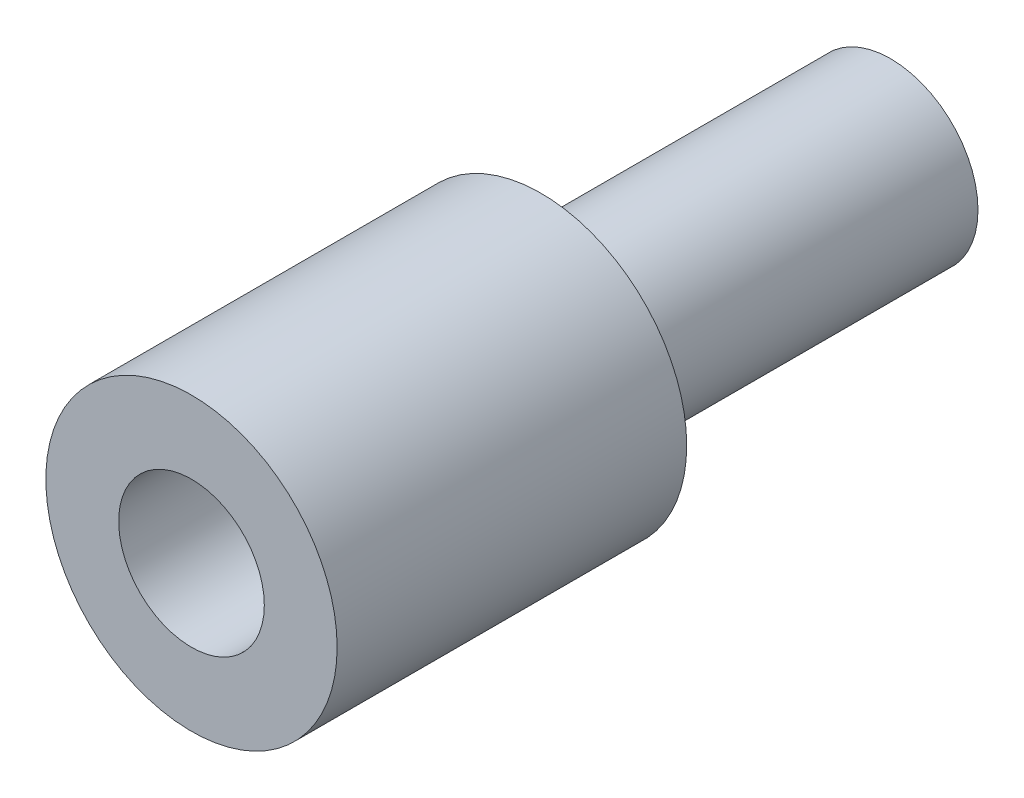
ISO-10303-21;
HEADER;
FILE_DESCRIPTION(('STEP AP214'),'2;1');
FILE_NAME('part.step','',(''),(''),'','','');
FILE_SCHEMA(('AUTOMOTIVE_DESIGN { 1 0 10303 214 1 1 1 1 }'));
ENDSEC;
DATA;
#1=APPLICATION_CONTEXT('core data for automotive mechanical design processes');
#2=APPLICATION_PROTOCOL_DEFINITION('international standard','automotive_design',2000,#1);
#3=PRODUCT_CONTEXT('',#1,'mechanical');
#4=PRODUCT('Part','Part','',(#3));
#5=PRODUCT_RELATED_PRODUCT_CATEGORY('part','',(#4));
#6=PRODUCT_DEFINITION_FORMATION('','',#4);
#7=PRODUCT_DEFINITION_CONTEXT('part definition',#1,'design');
#8=PRODUCT_DEFINITION('design','',#6,#7);
#9=PRODUCT_DEFINITION_SHAPE('','',#8);
#10=(LENGTH_UNIT() NAMED_UNIT(*) SI_UNIT(.MILLI.,.METRE.));
#11=(NAMED_UNIT(*) PLANE_ANGLE_UNIT() SI_UNIT($,.RADIAN.));
#12=(NAMED_UNIT(*) SI_UNIT($,.STERADIAN.) SOLID_ANGLE_UNIT());
#13=UNCERTAINTY_MEASURE_WITH_UNIT(LENGTH_MEASURE(1.E-05),#10,'distance_accuracy_value','');
#14=(GEOMETRIC_REPRESENTATION_CONTEXT(3) GLOBAL_UNCERTAINTY_ASSIGNED_CONTEXT((#13)) GLOBAL_UNIT_ASSIGNED_CONTEXT((#10,
#11,#12)) REPRESENTATION_CONTEXT('',''));
#15=CARTESIAN_POINT('',(0.,0.,0.));
#16=DIRECTION('',(0.,0.,1.));
#17=DIRECTION('',(1.,0.,0.));
#18=AXIS2_PLACEMENT_3D('',#15,#16,#17);
#19=CARTESIAN_POINT('',(0.,0.,6.));
#20=DIRECTION('',(0.,0.,-1.));
#21=DIRECTION('',(-1.,0.,0.));
#22=AXIS2_PLACEMENT_3D('',#19,#20,#21);
#23=CYLINDRICAL_SURFACE('',#22,1.5);
#24=CARTESIAN_POINT('',(0.,0.,6.));
#25=DIRECTION('',(0.,0.,1.));
#26=DIRECTION('',(1.,0.,0.));
#27=AXIS2_PLACEMENT_3D('',#24,#25,#26);
#28=CIRCLE('',#27,1.5);
#29=CARTESIAN_POINT('',(1.5,0.,6.));
#30=VERTEX_POINT('',#29);
#31=EDGE_CURVE('E10',#30,#30,#28,.T.);
#32=ORIENTED_EDGE('',*,*,#31,.F.);
#33=EDGE_LOOP('',(#32));
#34=FACE_BOUND('',#33,.T.);
#35=CARTESIAN_POINT('',(0.,0.,0.));
#36=DIRECTION('',(0.,0.,1.));
#37=DIRECTION('',(1.,0.,0.));
#38=AXIS2_PLACEMENT_3D('',#35,#36,#37);
#39=CIRCLE('',#38,1.5);
#40=CARTESIAN_POINT('',(1.5,0.,0.));
#41=VERTEX_POINT('',#40);
#42=EDGE_CURVE('E42',#41,#41,#39,.T.);
#43=ORIENTED_EDGE('',*,*,#42,.T.);
#44=EDGE_LOOP('',(#43));
#45=FACE_BOUND('',#44,.T.);
#46=ADVANCED_FACE('F39',(#34,#45),#23,.T.);
#47=CARTESIAN_POINT('',(0.,0.,0.));
#48=DIRECTION('',(0.,0.,1.));
#49=DIRECTION('',(1.,0.,0.));
#50=AXIS2_PLACEMENT_3D('',#47,#48,#49);
#51=PLANE('',#50);
#52=ORIENTED_EDGE('',*,*,#42,.F.);
#53=EDGE_LOOP('',(#52));
#54=FACE_BOUND('',#53,.T.);
#55=ADVANCED_FACE('F87',(#54),#51,.F.);
#56=CARTESIAN_POINT('',(0.,0.,12.));
#57=DIRECTION('',(0.,0.,-1.));
#58=DIRECTION('',(-1.,0.,0.));
#59=AXIS2_PLACEMENT_3D('',#56,#57,#58);
#60=CYLINDRICAL_SURFACE('',#59,2.5);
#61=CARTESIAN_POINT('',(0.,0.,12.));
#62=DIRECTION('',(0.,0.,1.));
#63=DIRECTION('',(1.,0.,0.));
#64=AXIS2_PLACEMENT_3D('',#61,#62,#63);
#65=CIRCLE('',#64,2.5);
#66=CARTESIAN_POINT('',(2.5,0.,12.));
#67=VERTEX_POINT('',#66);
#68=EDGE_CURVE('E51',#67,#67,#65,.T.);
#69=ORIENTED_EDGE('',*,*,#68,.F.);
#70=EDGE_LOOP('',(#69));
#71=FACE_BOUND('',#70,.T.);
#72=CARTESIAN_POINT('',(0.,0.,6.));
#73=DIRECTION('',(0.,0.,1.));
#74=DIRECTION('',(1.,0.,0.));
#75=AXIS2_PLACEMENT_3D('',#72,#73,#74);
#76=CIRCLE('',#75,2.5);
#77=CARTESIAN_POINT('',(2.5,0.,6.));
#78=VERTEX_POINT('',#77);
#79=EDGE_CURVE('E53',#78,#78,#76,.T.);
#80=ORIENTED_EDGE('',*,*,#79,.T.);
#81=EDGE_LOOP('',(#80));
#82=FACE_BOUND('',#81,.T.);
#83=ADVANCED_FACE('F81',(#71,#82),#60,.T.);
#84=CARTESIAN_POINT('',(0.,0.,12.));
#85=DIRECTION('',(0.,0.,1.));
#86=DIRECTION('',(1.,0.,0.));
#87=AXIS2_PLACEMENT_3D('',#84,#85,#86);
#88=PLANE('',#87);
#89=CARTESIAN_POINT('',(0.,0.,12.));
#90=DIRECTION('',(0.,0.,1.));
#91=DIRECTION('',(1.,0.,0.));
#92=AXIS2_PLACEMENT_3D('',#89,#90,#91);
#93=CIRCLE('',#92,1.25);
#94=CARTESIAN_POINT('',(1.25,0.,12.));
#95=VERTEX_POINT('',#94);
#96=EDGE_CURVE('E61',#95,#95,#93,.T.);
#97=ORIENTED_EDGE('',*,*,#96,.F.);
#98=EDGE_LOOP('',(#97));
#99=FACE_BOUND('',#98,.T.);
#100=ORIENTED_EDGE('',*,*,#68,.T.);
#101=EDGE_LOOP('',(#100));
#102=FACE_BOUND('',#101,.T.);
#103=ADVANCED_FACE('F78',(#99,#102),#88,.T.);
#104=CARTESIAN_POINT('',(0.,0.,6.));
#105=DIRECTION('',(0.,0.,1.));
#106=DIRECTION('',(1.,0.,0.));
#107=AXIS2_PLACEMENT_3D('',#104,#105,#106);
#108=PLANE('',#107);
#109=ORIENTED_EDGE('',*,*,#31,.T.);
#110=EDGE_LOOP('',(#109));
#111=FACE_BOUND('',#110,.T.);
#112=ORIENTED_EDGE('',*,*,#79,.F.);
#113=EDGE_LOOP('',(#112));
#114=FACE_BOUND('',#113,.T.);
#115=ADVANCED_FACE('F74',(#111,#114),#108,.F.);
#116=CARTESIAN_POINT('',(0.,0.,6.));
#117=DIRECTION('',(0.,0.,1.));
#118=DIRECTION('',(1.,0.,0.));
#119=AXIS2_PLACEMENT_3D('',#116,#117,#118);
#120=CYLINDRICAL_SURFACE('',#119,1.25);
#121=CARTESIAN_POINT('',(0.,0.,6.));
#122=DIRECTION('',(0.,0.,1.));
#123=DIRECTION('',(1.,0.,0.));
#124=AXIS2_PLACEMENT_3D('',#121,#122,#123);
#125=CIRCLE('',#124,1.25);
#126=CARTESIAN_POINT('',(1.25,0.,6.));
#127=VERTEX_POINT('',#126);
#128=EDGE_CURVE('E57',#127,#127,#125,.T.);
#129=ORIENTED_EDGE('',*,*,#128,.F.);
#130=EDGE_LOOP('',(#129));
#131=FACE_BOUND('',#130,.T.);
#132=ORIENTED_EDGE('',*,*,#96,.T.);
#133=EDGE_LOOP('',(#132));
#134=FACE_BOUND('',#133,.T.);
#135=ADVANCED_FACE('F71',(#131,#134),#120,.F.);
#136=CARTESIAN_POINT('',(0.,0.,6.));
#137=DIRECTION('',(0.,0.,1.));
#138=DIRECTION('',(1.,0.,0.));
#139=AXIS2_PLACEMENT_3D('',#136,#137,#138);
#140=PLANE('',#139);
#141=ORIENTED_EDGE('',*,*,#128,.T.);
#142=EDGE_LOOP('',(#141));
#143=FACE_BOUND('',#142,.T.);
#144=ADVANCED_FACE('F69',(#143),#140,.T.);
#145=CLOSED_SHELL('',(#46,#55,#83,#103,#115,#135,#144));
#146=MANIFOLD_SOLID_BREP('B2',#145);
#147=ADVANCED_BREP_SHAPE_REPRESENTATION('',(#18,#146),#14);
#148=SHAPE_DEFINITION_REPRESENTATION(#9,#147);
ENDSEC;
END-ISO-10303-21;
